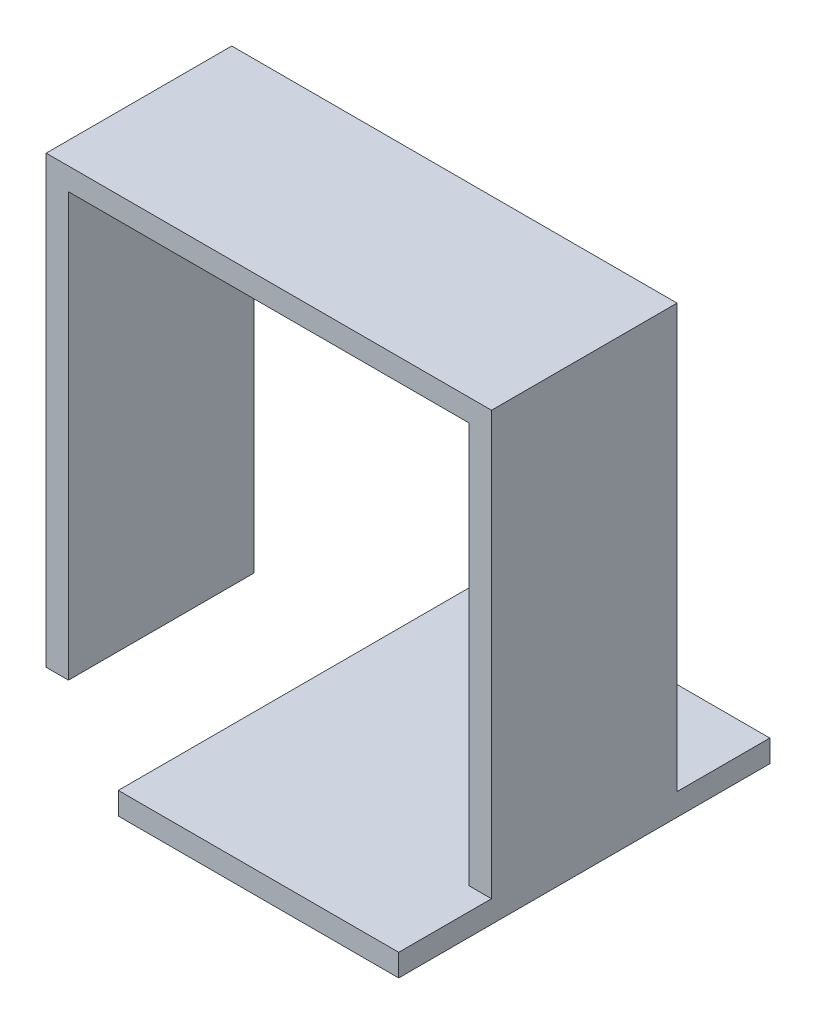
ISO-10303-21;
HEADER;
FILE_DESCRIPTION(('STEP AP214'),'2;1');
FILE_NAME('part.step','',(''),(''),'','','');
FILE_SCHEMA(('AUTOMOTIVE_DESIGN { 1 0 10303 214 1 1 1 1 }'));
ENDSEC;
DATA;
#1=APPLICATION_CONTEXT('core data for automotive mechanical design processes');
#2=APPLICATION_PROTOCOL_DEFINITION('international standard','automotive_design',2000,#1);
#3=PRODUCT_CONTEXT('',#1,'mechanical');
#4=PRODUCT('Part','Part','',(#3));
#5=PRODUCT_RELATED_PRODUCT_CATEGORY('part','',(#4));
#6=PRODUCT_DEFINITION_FORMATION('','',#4);
#7=PRODUCT_DEFINITION_CONTEXT('part definition',#1,'design');
#8=PRODUCT_DEFINITION('design','',#6,#7);
#9=PRODUCT_DEFINITION_SHAPE('','',#8);
#10=(LENGTH_UNIT() NAMED_UNIT(*) SI_UNIT(.MILLI.,.METRE.));
#11=(NAMED_UNIT(*) PLANE_ANGLE_UNIT() SI_UNIT($,.RADIAN.));
#12=(NAMED_UNIT(*) SI_UNIT($,.STERADIAN.) SOLID_ANGLE_UNIT());
#13=UNCERTAINTY_MEASURE_WITH_UNIT(LENGTH_MEASURE(1.E-05),#10,'distance_accuracy_value','');
#14=(GEOMETRIC_REPRESENTATION_CONTEXT(3) GLOBAL_UNCERTAINTY_ASSIGNED_CONTEXT((#13)) GLOBAL_UNIT_ASSIGNED_CONTEXT((#10,
#11,#12)) REPRESENTATION_CONTEXT('',''));
#15=CARTESIAN_POINT('',(0.,0.,0.));
#16=DIRECTION('',(0.,0.,1.));
#17=DIRECTION('',(1.,0.,0.));
#18=AXIS2_PLACEMENT_3D('',#15,#16,#17);
#19=CARTESIAN_POINT('',(0.,0.,0.));
#20=DIRECTION('',(0.,-1.,0.));
#21=DIRECTION('',(0.,0.,-1.));
#22=AXIS2_PLACEMENT_3D('',#19,#20,#21);
#23=PLANE('',#22);
#24=DIRECTION('',(1.,0.,0.));
#25=VECTOR('',#24,1.);
#26=CARTESIAN_POINT('',(-49.8532727272727,0.,10.0445454545454));
#27=LINE('',#26,#25);
#28=CARTESIAN_POINT('',(-19.6272727272727,0.,10.0445454545454));
#29=VERTEX_POINT('',#28);
#30=CARTESIAN_POINT('',(-18.1032727272727,0.,10.0445454545454));
#31=VERTEX_POINT('',#30);
#32=EDGE_CURVE('E147',#29,#31,#27,.T.);
#33=ORIENTED_EDGE('',*,*,#32,.F.);
#34=DIRECTION('',(0.,0.,1.));
#35=VECTOR('',#34,1.);
#36=CARTESIAN_POINT('',(-19.6272727272727,0.,16.3945454545454));
#37=LINE('',#36,#35);
#38=CARTESIAN_POINT('',(-19.6272727272727,0.,-2.65545454545456));
#39=VERTEX_POINT('',#38);
#40=EDGE_CURVE('E145',#39,#29,#37,.T.);
#41=ORIENTED_EDGE('',*,*,#40,.F.);
#42=DIRECTION('',(1.,0.,0.));
#43=VECTOR('',#42,1.);
#44=CARTESIAN_POINT('',(-49.8532727272727,0.,-2.65545454545456));
#45=LINE('',#44,#43);
#46=CARTESIAN_POINT('',(-18.1032727272727,0.,-2.65545454545456));
#47=VERTEX_POINT('',#46);
#48=EDGE_CURVE('E133',#39,#47,#45,.T.);
#49=ORIENTED_EDGE('',*,*,#48,.T.);
#50=DIRECTION('',(0.,0.,1.));
#51=VECTOR('',#50,1.);
#52=CARTESIAN_POINT('',(-18.1032727272727,0.,-9.00545454545456));
#53=LINE('',#52,#51);
#54=EDGE_CURVE('E143',#47,#31,#53,.T.);
#55=ORIENTED_EDGE('',*,*,#54,.T.);
#56=EDGE_LOOP('',(#33,#41,#49,#55));
#57=FACE_BOUND('',#56,.T.);
#58=ADVANCED_FACE('F38',(#57),#23,.T.);
#59=CARTESIAN_POINT('',(-19.6272727272727,30.48,16.3945454545454));
#60=DIRECTION('',(1.,0.,0.));
#61=DIRECTION('',(0.,0.,-1.));
#62=AXIS2_PLACEMENT_3D('',#59,#60,#61);
#63=PLANE('',#62);
#64=ORIENTED_EDGE('',*,*,#40,.T.);
#65=DIRECTION('',(0.,1.,0.));
#66=VECTOR('',#65,1.);
#67=CARTESIAN_POINT('',(-19.6272727272727,30.48,10.0445454545454));
#68=LINE('',#67,#66);
#69=CARTESIAN_POINT('',(-19.6272727272727,30.48,10.0445454545454));
#70=VERTEX_POINT('',#69);
#71=EDGE_CURVE('E181',#29,#70,#68,.T.);
#72=ORIENTED_EDGE('',*,*,#71,.T.);
#73=DIRECTION('',(0.,0.,1.));
#74=VECTOR('',#73,1.);
#75=CARTESIAN_POINT('',(-19.6272727272727,30.48,16.3945454545454));
#76=LINE('',#75,#74);
#77=CARTESIAN_POINT('',(-19.6272727272727,30.48,-2.65545454545455));
#78=VERTEX_POINT('',#77);
#79=EDGE_CURVE('E221',#78,#70,#76,.T.);
#80=ORIENTED_EDGE('',*,*,#79,.F.);
#81=DIRECTION('',(0.,-1.,0.));
#82=VECTOR('',#81,1.);
#83=CARTESIAN_POINT('',(-19.6272727272727,30.48,-2.65545454545456));
#84=LINE('',#83,#82);
#85=EDGE_CURVE('E203',#78,#39,#84,.T.);
#86=ORIENTED_EDGE('',*,*,#85,.T.);
#87=EDGE_LOOP('',(#64,#72,#80,#86));
#88=FACE_BOUND('',#87,.T.);
#89=ADVANCED_FACE('F40',(#88),#63,.F.);
#90=CARTESIAN_POINT('',(-19.6272727272727,30.48,16.3945454545454));
#91=DIRECTION('',(0.,0.,-1.));
#92=DIRECTION('',(-1.,0.,0.));
#93=AXIS2_PLACEMENT_3D('',#90,#91,#92);
#94=PLANE('',#93);
#95=DIRECTION('',(1.,0.,0.));
#96=VECTOR('',#95,1.);
#97=CARTESIAN_POINT('',(-19.6272727272727,1.524,16.3945454545454));
#98=LINE('',#97,#96);
#99=CARTESIAN_POINT('',(-8.34236585787504,1.524,16.3945454545454));
#100=VERTEX_POINT('',#99);
#101=CARTESIAN_POINT('',(10.8527272727273,1.524,16.3945454545454));
#102=VERTEX_POINT('',#101);
#103=EDGE_CURVE('E185',#100,#102,#98,.T.);
#104=ORIENTED_EDGE('',*,*,#103,.F.);
#105=DIRECTION('',(0.,1.,0.));
#106=VECTOR('',#105,1.);
#107=CARTESIAN_POINT('',(-8.34236585787503,1.52399999999999,16.3945454545454));
#108=LINE('',#107,#106);
#109=CARTESIAN_POINT('',(-8.34236585787503,0.,16.3945454545454));
#110=VERTEX_POINT('',#109);
#111=EDGE_CURVE('E62',#110,#100,#108,.T.);
#112=ORIENTED_EDGE('',*,*,#111,.F.);
#113=DIRECTION('',(1.,0.,0.));
#114=VECTOR('',#113,1.);
#115=CARTESIAN_POINT('',(-19.6272727272727,0.,16.3945454545454));
#116=LINE('',#115,#114);
#117=CARTESIAN_POINT('',(10.8527272727273,0.,16.3945454545454));
#118=VERTEX_POINT('',#117);
#119=EDGE_CURVE('E233',#110,#118,#116,.T.);
#120=ORIENTED_EDGE('',*,*,#119,.T.);
#121=DIRECTION('',(0.,-1.,0.));
#122=VECTOR('',#121,1.);
#123=CARTESIAN_POINT('',(10.8527272727273,30.48,16.3945454545454));
#124=LINE('',#123,#122);
#125=EDGE_CURVE('E245',#102,#118,#124,.T.);
#126=ORIENTED_EDGE('',*,*,#125,.F.);
#127=EDGE_LOOP('',(#104,#112,#120,#126));
#128=FACE_BOUND('',#127,.T.);
#129=ADVANCED_FACE('F258',(#128),#94,.F.);
#130=CARTESIAN_POINT('',(10.8527272727273,30.48,16.3945454545454));
#131=DIRECTION('',(-1.,0.,0.));
#132=DIRECTION('',(0.,0.,1.));
#133=AXIS2_PLACEMENT_3D('',#130,#131,#132);
#134=PLANE('',#133);
#135=DIRECTION('',(0.,0.,-1.));
#136=VECTOR('',#135,1.);
#137=CARTESIAN_POINT('',(10.8527272727273,30.48,16.3945454545454));
#138=LINE('',#137,#136);
#139=CARTESIAN_POINT('',(10.8527272727273,30.48,10.0445454545454));
#140=VERTEX_POINT('',#139);
#141=CARTESIAN_POINT('',(10.8527272727273,30.48,-2.65545454545456));
#142=VERTEX_POINT('',#141);
#143=EDGE_CURVE('E225',#140,#142,#138,.T.);
#144=ORIENTED_EDGE('',*,*,#143,.F.);
#145=DIRECTION('',(0.,1.,0.));
#146=VECTOR('',#145,1.);
#147=CARTESIAN_POINT('',(10.8527272727273,30.48,10.0445454545454));
#148=LINE('',#147,#146);
#149=CARTESIAN_POINT('',(10.8527272727273,1.524,10.0445454545454));
#150=VERTEX_POINT('',#149);
#151=EDGE_CURVE('E186',#150,#140,#148,.T.);
#152=ORIENTED_EDGE('',*,*,#151,.F.);
#153=DIRECTION('',(0.,0.,-1.));
#154=VECTOR('',#153,1.);
#155=CARTESIAN_POINT('',(10.8527272727273,1.524,16.3945454545454));
#156=LINE('',#155,#154);
#157=EDGE_CURVE('E187',#102,#150,#156,.T.);
#158=ORIENTED_EDGE('',*,*,#157,.F.);
#159=ORIENTED_EDGE('',*,*,#125,.T.);
#160=DIRECTION('',(0.,0.,-1.));
#161=VECTOR('',#160,1.);
#162=CARTESIAN_POINT('',(10.8527272727273,0.,16.3945454545454));
#163=LINE('',#162,#161);
#164=CARTESIAN_POINT('',(10.8527272727273,0.,-9.00545454545456));
#165=VERTEX_POINT('',#164);
#166=EDGE_CURVE('E236',#118,#165,#163,.T.);
#167=ORIENTED_EDGE('',*,*,#166,.T.);
#168=DIRECTION('',(0.,-1.,0.));
#169=VECTOR('',#168,1.);
#170=CARTESIAN_POINT('',(10.8527272727273,30.48,-9.00545454545456));
#171=LINE('',#170,#169);
#172=CARTESIAN_POINT('',(10.8527272727273,1.524,-9.00545454545456));
#173=VERTEX_POINT('',#172);
#174=EDGE_CURVE('E230',#173,#165,#171,.T.);
#175=ORIENTED_EDGE('',*,*,#174,.F.);
#176=DIRECTION('',(0.,0.,-1.));
#177=VECTOR('',#176,1.);
#178=CARTESIAN_POINT('',(10.8527272727273,1.524,-9.00545454545456));
#179=LINE('',#178,#177);
#180=CARTESIAN_POINT('',(10.8527272727273,1.524,-2.65545454545456));
#181=VERTEX_POINT('',#180);
#182=EDGE_CURVE('E207',#181,#173,#179,.T.);
#183=ORIENTED_EDGE('',*,*,#182,.F.);
#184=DIRECTION('',(0.,-1.,0.));
#185=VECTOR('',#184,1.);
#186=CARTESIAN_POINT('',(10.8527272727273,30.48,-2.65545454545456));
#187=LINE('',#186,#185);
#188=EDGE_CURVE('E180',#142,#181,#187,.T.);
#189=ORIENTED_EDGE('',*,*,#188,.F.);
#190=EDGE_LOOP('',(#144,#152,#158,#159,#167,#175,#183,#189));
#191=FACE_BOUND('',#190,.T.);
#192=ADVANCED_FACE('F263',(#191),#134,.F.);
#193=CARTESIAN_POINT('',(-19.6272727272727,30.48,-9.00545454545456));
#194=DIRECTION('',(0.,0.,1.));
#195=DIRECTION('',(1.,0.,0.));
#196=AXIS2_PLACEMENT_3D('',#193,#194,#195);
#197=PLANE('',#196);
#198=DIRECTION('',(-1.,0.,0.));
#199=VECTOR('',#198,1.);
#200=CARTESIAN_POINT('',(-19.6272727272727,0.,-9.00545454545456));
#201=LINE('',#200,#199);
#202=CARTESIAN_POINT('',(-8.34236585787503,0.,-9.00545454545456));
#203=VERTEX_POINT('',#202);
#204=EDGE_CURVE('E226',#165,#203,#201,.T.);
#205=ORIENTED_EDGE('',*,*,#204,.T.);
#206=DIRECTION('',(0.,1.,0.));
#207=VECTOR('',#206,1.);
#208=CARTESIAN_POINT('',(-8.34236585787503,1.52399999999999,-9.00545454545456));
#209=LINE('',#208,#207);
#210=CARTESIAN_POINT('',(-8.34236585787503,1.52399999999999,-9.00545454545456));
#211=VERTEX_POINT('',#210);
#212=EDGE_CURVE('E162',#203,#211,#209,.T.);
#213=ORIENTED_EDGE('',*,*,#212,.T.);
#214=DIRECTION('',(1.,0.,0.));
#215=VECTOR('',#214,1.);
#216=CARTESIAN_POINT('',(-19.6272727272727,1.524,-9.00545454545456));
#217=LINE('',#216,#215);
#218=EDGE_CURVE('E191',#211,#173,#217,.T.);
#219=ORIENTED_EDGE('',*,*,#218,.T.);
#220=ORIENTED_EDGE('',*,*,#174,.T.);
#221=EDGE_LOOP('',(#205,#213,#219,#220));
#222=FACE_BOUND('',#221,.T.);
#223=ADVANCED_FACE('F271',(#222),#197,.F.);
#224=CARTESIAN_POINT('',(0.,30.48,0.));
#225=DIRECTION('',(0.,-1.,0.));
#226=DIRECTION('',(0.,0.,-1.));
#227=AXIS2_PLACEMENT_3D('',#224,#225,#226);
#228=PLANE('',#227);
#229=ORIENTED_EDGE('',*,*,#79,.T.);
#230=DIRECTION('',(1.,0.,0.));
#231=VECTOR('',#230,1.);
#232=CARTESIAN_POINT('',(-19.6272727272727,30.48,10.0445454545454));
#233=LINE('',#232,#231);
#234=EDGE_CURVE('E194',#70,#140,#233,.T.);
#235=ORIENTED_EDGE('',*,*,#234,.T.);
#236=ORIENTED_EDGE('',*,*,#143,.T.);
#237=DIRECTION('',(1.,0.,0.));
#238=VECTOR('',#237,1.);
#239=CARTESIAN_POINT('',(-19.6272727272727,30.48,-2.65545454545456));
#240=LINE('',#239,#238);
#241=EDGE_CURVE('E206',#78,#142,#240,.T.);
#242=ORIENTED_EDGE('',*,*,#241,.F.);
#243=EDGE_LOOP('',(#229,#235,#236,#242));
#244=FACE_BOUND('',#243,.T.);
#245=ADVANCED_FACE('F279',(#244),#228,.F.);
#246=DIRECTION('',(0.,0.,1.));
#247=VECTOR('',#246,1.);
#248=CARTESIAN_POINT('',(-8.34236585787503,0.,-9.00545454545456));
#249=LINE('',#248,#247);
#250=EDGE_CURVE('E171',#203,#110,#249,.T.);
#251=ORIENTED_EDGE('',*,*,#250,.F.);
#252=ORIENTED_EDGE('',*,*,#204,.F.);
#253=ORIENTED_EDGE('',*,*,#166,.F.);
#254=ORIENTED_EDGE('',*,*,#119,.F.);
#255=EDGE_LOOP('',(#251,#252,#253,#254));
#256=FACE_BOUND('',#255,.T.);
#257=ADVANCED_FACE('F269',(#256),#23,.T.);
#258=CARTESIAN_POINT('',(-19.6272727272727,30.48,-2.65545454545456));
#259=DIRECTION('',(0.,0.,1.));
#260=DIRECTION('',(0.,-1.,0.));
#261=AXIS2_PLACEMENT_3D('',#258,#259,#260);
#262=PLANE('',#261);
#263=DIRECTION('',(-1.,0.,0.));
#264=VECTOR('',#263,1.);
#265=CARTESIAN_POINT('',(-19.6272727272727,28.956,-2.65545454545456));
#266=LINE('',#265,#264);
#267=CARTESIAN_POINT('',(9.32872727272726,28.956,-2.65545454545456));
#268=VERTEX_POINT('',#267);
#269=CARTESIAN_POINT('',(-18.1032727272727,28.956,-2.65545454545456));
#270=VERTEX_POINT('',#269);
#271=EDGE_CURVE('E136',#268,#270,#266,.T.);
#272=ORIENTED_EDGE('',*,*,#271,.T.);
#273=DIRECTION('',(0.,-1.,0.));
#274=VECTOR('',#273,1.);
#275=CARTESIAN_POINT('',(-18.1032727272727,30.48,-2.65545454545456));
#276=LINE('',#275,#274);
#277=EDGE_CURVE('E130',#270,#47,#276,.T.);
#278=ORIENTED_EDGE('',*,*,#277,.T.);
#279=ORIENTED_EDGE('',*,*,#48,.F.);
#280=ORIENTED_EDGE('',*,*,#85,.F.);
#281=ORIENTED_EDGE('',*,*,#241,.T.);
#282=ORIENTED_EDGE('',*,*,#188,.T.);
#283=DIRECTION('',(1.,0.,0.));
#284=VECTOR('',#283,1.);
#285=CARTESIAN_POINT('',(-19.6272727272727,1.524,-2.65545454545456));
#286=LINE('',#285,#284);
#287=CARTESIAN_POINT('',(9.32872727272727,1.52399999999999,-2.65545454545456));
#288=VERTEX_POINT('',#287);
#289=EDGE_CURVE('E216',#288,#181,#286,.T.);
#290=ORIENTED_EDGE('',*,*,#289,.F.);
#291=DIRECTION('',(0.,1.,0.));
#292=VECTOR('',#291,1.);
#293=CARTESIAN_POINT('',(9.32872727272726,30.48,-2.65545454545456));
#294=LINE('',#293,#292);
#295=EDGE_CURVE('E157',#288,#268,#294,.T.);
#296=ORIENTED_EDGE('',*,*,#295,.T.);
#297=EDGE_LOOP('',(#272,#278,#279,#280,#281,#282,#290,#296));
#298=FACE_BOUND('',#297,.T.);
#299=ADVANCED_FACE('F132',(#298),#262,.F.);
#300=CARTESIAN_POINT('',(-19.6272727272727,30.48,10.0445454545454));
#301=DIRECTION('',(0.,0.,-1.));
#302=DIRECTION('',(0.,1.,0.));
#303=AXIS2_PLACEMENT_3D('',#300,#301,#302);
#304=PLANE('',#303);
#305=ORIENTED_EDGE('',*,*,#71,.F.);
#306=ORIENTED_EDGE('',*,*,#32,.T.);
#307=DIRECTION('',(0.,1.,0.));
#308=VECTOR('',#307,1.);
#309=CARTESIAN_POINT('',(-18.1032727272727,30.48,10.0445454545454));
#310=LINE('',#309,#308);
#311=CARTESIAN_POINT('',(-18.1032727272727,28.956,10.0445454545454));
#312=VERTEX_POINT('',#311);
#313=EDGE_CURVE('E54',#31,#312,#310,.T.);
#314=ORIENTED_EDGE('',*,*,#313,.T.);
#315=DIRECTION('',(1.,0.,0.));
#316=VECTOR('',#315,1.);
#317=CARTESIAN_POINT('',(-19.6272727272727,28.956,10.0445454545454));
#318=LINE('',#317,#316);
#319=CARTESIAN_POINT('',(9.32872727272726,28.956,10.0445454545454));
#320=VERTEX_POINT('',#319);
#321=EDGE_CURVE('E11',#312,#320,#318,.T.);
#322=ORIENTED_EDGE('',*,*,#321,.T.);
#323=DIRECTION('',(0.,-1.,0.));
#324=VECTOR('',#323,1.);
#325=CARTESIAN_POINT('',(9.32872727272726,30.48,10.0445454545454));
#326=LINE('',#325,#324);
#327=CARTESIAN_POINT('',(9.32872727272727,1.52399999999999,10.0445454545454));
#328=VERTEX_POINT('',#327);
#329=EDGE_CURVE('E151',#320,#328,#326,.T.);
#330=ORIENTED_EDGE('',*,*,#329,.T.);
#331=DIRECTION('',(1.,0.,0.));
#332=VECTOR('',#331,1.);
#333=CARTESIAN_POINT('',(-19.6272727272727,1.524,10.0445454545454));
#334=LINE('',#333,#332);
#335=EDGE_CURVE('E198',#328,#150,#334,.T.);
#336=ORIENTED_EDGE('',*,*,#335,.T.);
#337=ORIENTED_EDGE('',*,*,#151,.T.);
#338=ORIENTED_EDGE('',*,*,#234,.F.);
#339=EDGE_LOOP('',(#305,#306,#314,#322,#330,#336,#337,#338));
#340=FACE_BOUND('',#339,.T.);
#341=ADVANCED_FACE('F282',(#340),#304,.F.);
#342=CARTESIAN_POINT('',(-19.6272727272727,1.524,16.3945454545454));
#343=DIRECTION('',(0.,-1.,0.));
#344=DIRECTION('',(0.,0.,-1.));
#345=AXIS2_PLACEMENT_3D('',#342,#343,#344);
#346=PLANE('',#345);
#347=ORIENTED_EDGE('',*,*,#335,.F.);
#348=DIRECTION('',(0.,0.,1.));
#349=VECTOR('',#348,1.);
#350=CARTESIAN_POINT('',(9.32872727272727,1.52399999999999,-9.00545454545456));
#351=LINE('',#350,#349);
#352=EDGE_CURVE('E168',#288,#328,#351,.T.);
#353=ORIENTED_EDGE('',*,*,#352,.F.);
#354=ORIENTED_EDGE('',*,*,#289,.T.);
#355=ORIENTED_EDGE('',*,*,#182,.T.);
#356=ORIENTED_EDGE('',*,*,#218,.F.);
#357=DIRECTION('',(0.,0.,1.));
#358=VECTOR('',#357,1.);
#359=CARTESIAN_POINT('',(-8.34236585787503,1.524,16.3945454545454));
#360=LINE('',#359,#358);
#361=EDGE_CURVE('E47',#211,#100,#360,.T.);
#362=ORIENTED_EDGE('',*,*,#361,.T.);
#363=ORIENTED_EDGE('',*,*,#103,.T.);
#364=ORIENTED_EDGE('',*,*,#157,.T.);
#365=EDGE_LOOP('',(#347,#353,#354,#355,#356,#362,#363,#364));
#366=FACE_BOUND('',#365,.T.);
#367=ADVANCED_FACE('F253',(#366),#346,.F.);
#368=CARTESIAN_POINT('',(-18.1032727272727,28.956,-9.00545454545456));
#369=DIRECTION('',(0.,1.,0.));
#370=DIRECTION('',(0.,0.,1.));
#371=AXIS2_PLACEMENT_3D('',#368,#369,#370);
#372=PLANE('',#371);
#373=DIRECTION('',(0.,0.,1.));
#374=VECTOR('',#373,1.);
#375=CARTESIAN_POINT('',(9.32872727272726,28.956,-9.00545454545456));
#376=LINE('',#375,#374);
#377=EDGE_CURVE('E159',#268,#320,#376,.T.);
#378=ORIENTED_EDGE('',*,*,#377,.T.);
#379=ORIENTED_EDGE('',*,*,#321,.F.);
#380=DIRECTION('',(0.,0.,1.));
#381=VECTOR('',#380,1.);
#382=CARTESIAN_POINT('',(-18.1032727272727,28.956,-9.00545454545456));
#383=LINE('',#382,#381);
#384=EDGE_CURVE('E152',#270,#312,#383,.T.);
#385=ORIENTED_EDGE('',*,*,#384,.F.);
#386=ORIENTED_EDGE('',*,*,#271,.F.);
#387=EDGE_LOOP('',(#378,#379,#385,#386));
#388=FACE_BOUND('',#387,.T.);
#389=ADVANCED_FACE('F291',(#388),#372,.F.);
#390=CARTESIAN_POINT('',(-18.1032727272727,0.,-9.00545454545456));
#391=DIRECTION('',(-1.,0.,0.));
#392=DIRECTION('',(0.,0.,1.));
#393=AXIS2_PLACEMENT_3D('',#390,#391,#392);
#394=PLANE('',#393);
#395=ORIENTED_EDGE('',*,*,#313,.F.);
#396=ORIENTED_EDGE('',*,*,#54,.F.);
#397=ORIENTED_EDGE('',*,*,#277,.F.);
#398=ORIENTED_EDGE('',*,*,#384,.T.);
#399=EDGE_LOOP('',(#395,#396,#397,#398));
#400=FACE_BOUND('',#399,.T.);
#401=ADVANCED_FACE('F149',(#400),#394,.F.);
#402=CARTESIAN_POINT('',(9.32872727272726,28.956,-9.00545454545456));
#403=DIRECTION('',(1.,0.,0.));
#404=DIRECTION('',(0.,1.,0.));
#405=AXIS2_PLACEMENT_3D('',#402,#403,#404);
#406=PLANE('',#405);
#407=ORIENTED_EDGE('',*,*,#352,.T.);
#408=ORIENTED_EDGE('',*,*,#329,.F.);
#409=ORIENTED_EDGE('',*,*,#377,.F.);
#410=ORIENTED_EDGE('',*,*,#295,.F.);
#411=EDGE_LOOP('',(#407,#408,#409,#410));
#412=FACE_BOUND('',#411,.T.);
#413=ADVANCED_FACE('F289',(#412),#406,.F.);
#414=CARTESIAN_POINT('',(-8.34236585787503,1.52399999999999,-9.00545454545456));
#415=DIRECTION('',(1.,0.,0.));
#416=DIRECTION('',(0.,0.,-1.));
#417=AXIS2_PLACEMENT_3D('',#414,#415,#416);
#418=PLANE('',#417);
#419=ORIENTED_EDGE('',*,*,#361,.F.);
#420=ORIENTED_EDGE('',*,*,#212,.F.);
#421=ORIENTED_EDGE('',*,*,#250,.T.);
#422=ORIENTED_EDGE('',*,*,#111,.T.);
#423=EDGE_LOOP('',(#419,#420,#421,#422));
#424=FACE_BOUND('',#423,.T.);
#425=ADVANCED_FACE('F320',(#424),#418,.F.);
#426=CLOSED_SHELL('',(#58,#89,#129,#192,#223,#245,#257,#299,#341,#367,#389,#401,#413,#425));
#427=MANIFOLD_SOLID_BREP('B2',#426);
#428=ADVANCED_BREP_SHAPE_REPRESENTATION('',(#18,#427),#14);
#429=SHAPE_DEFINITION_REPRESENTATION(#9,#428);
ENDSEC;
END-ISO-10303-21;
